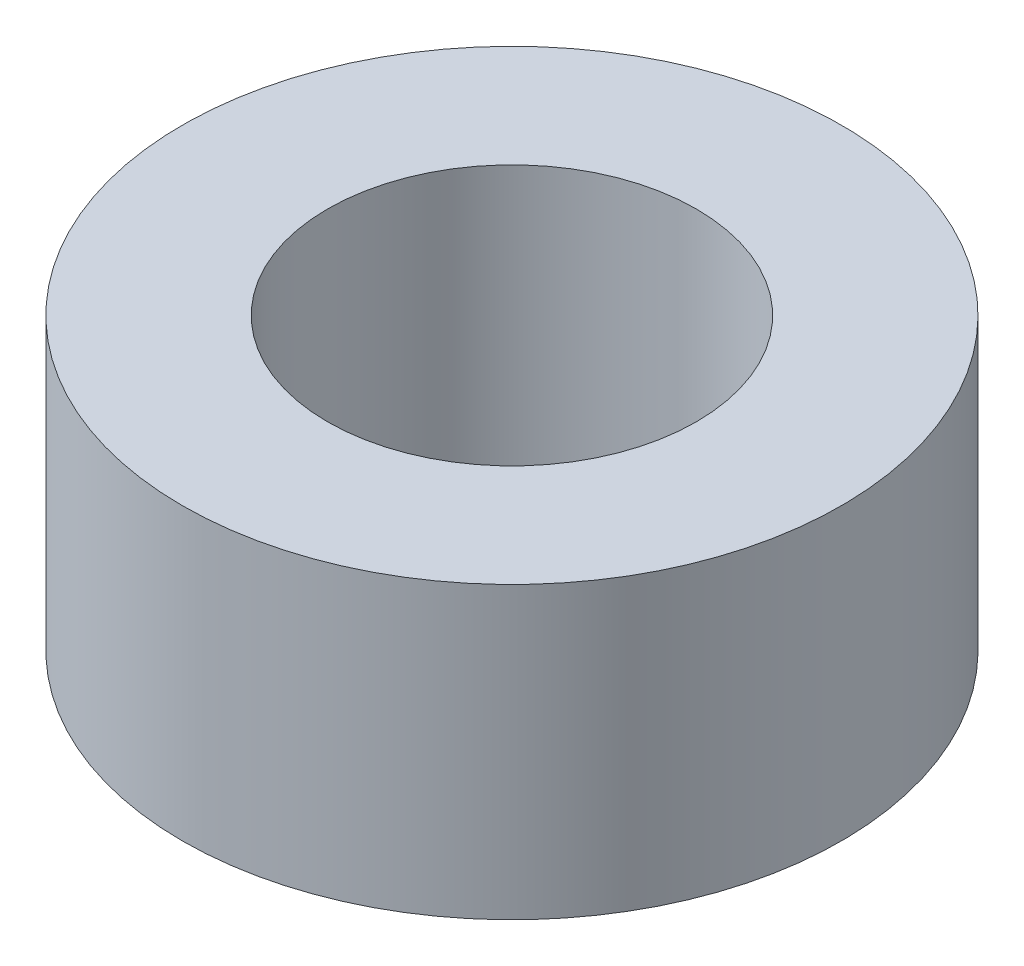
ISO-10303-21;
HEADER;
FILE_DESCRIPTION(('STEP AP214'),'2;1');
FILE_NAME('part.step','',(''),(''),'','','');
FILE_SCHEMA(('AUTOMOTIVE_DESIGN { 1 0 10303 214 1 1 1 1 }'));
ENDSEC;
DATA;
#1=APPLICATION_CONTEXT('core data for automotive mechanical design processes');
#2=APPLICATION_PROTOCOL_DEFINITION('international standard','automotive_design',2000,#1);
#3=PRODUCT_CONTEXT('',#1,'mechanical');
#4=PRODUCT('Part','Part','',(#3));
#5=PRODUCT_RELATED_PRODUCT_CATEGORY('part','',(#4));
#6=PRODUCT_DEFINITION_FORMATION('','',#4);
#7=PRODUCT_DEFINITION_CONTEXT('part definition',#1,'design');
#8=PRODUCT_DEFINITION('design','',#6,#7);
#9=PRODUCT_DEFINITION_SHAPE('','',#8);
#10=(LENGTH_UNIT() NAMED_UNIT(*) SI_UNIT(.MILLI.,.METRE.));
#11=(NAMED_UNIT(*) PLANE_ANGLE_UNIT() SI_UNIT($,.RADIAN.));
#12=(NAMED_UNIT(*) SI_UNIT($,.STERADIAN.) SOLID_ANGLE_UNIT());
#13=UNCERTAINTY_MEASURE_WITH_UNIT(LENGTH_MEASURE(1.E-05),#10,'distance_accuracy_value','');
#14=(GEOMETRIC_REPRESENTATION_CONTEXT(3) GLOBAL_UNCERTAINTY_ASSIGNED_CONTEXT((#13)) GLOBAL_UNIT_ASSIGNED_CONTEXT((#10,
#11,#12)) REPRESENTATION_CONTEXT('',''));
#15=CARTESIAN_POINT('',(0.,0.,0.));
#16=DIRECTION('',(0.,0.,1.));
#17=DIRECTION('',(1.,0.,0.));
#18=AXIS2_PLACEMENT_3D('',#15,#16,#17);
#19=CARTESIAN_POINT('',(0.,10.,0.));
#20=DIRECTION('',(0.,1.,0.));
#21=DIRECTION('',(0.,0.,1.));
#22=AXIS2_PLACEMENT_3D('',#19,#20,#21);
#23=PLANE('',#22);
#24=CARTESIAN_POINT('',(0.,10.,0.));
#25=DIRECTION('',(0.,1.,0.));
#26=DIRECTION('',(0.,0.,1.));
#27=AXIS2_PLACEMENT_3D('',#24,#25,#26);
#28=CIRCLE('',#27,22.7);
#29=CARTESIAN_POINT('',(0.,10.,22.7));
#30=VERTEX_POINT('',#29);
#31=EDGE_CURVE('E139',#30,#30,#28,.T.);
#32=ORIENTED_EDGE('',*,*,#31,.T.);
#33=EDGE_LOOP('',(#32));
#34=FACE_BOUND('',#33,.T.);
#35=CARTESIAN_POINT('',(0.,10.,0.));
#36=DIRECTION('',(0.,1.,0.));
#37=DIRECTION('',(0.,0.,1.));
#38=AXIS2_PLACEMENT_3D('',#35,#36,#37);
#39=CIRCLE('',#38,12.7);
#40=CARTESIAN_POINT('',(0.,10.,12.7));
#41=VERTEX_POINT('',#40);
#42=EDGE_CURVE('E133',#41,#41,#39,.T.);
#43=ORIENTED_EDGE('',*,*,#42,.F.);
#44=EDGE_LOOP('',(#43));
#45=FACE_BOUND('',#44,.T.);
#46=ADVANCED_FACE('F35',(#34,#45),#23,.T.);
#47=CARTESIAN_POINT('',(0.,-10.,0.));
#48=DIRECTION('',(0.,1.,0.));
#49=DIRECTION('',(0.,0.,1.));
#50=AXIS2_PLACEMENT_3D('',#47,#48,#49);
#51=PLANE('',#50);
#52=CARTESIAN_POINT('',(0.,-10.,0.));
#53=DIRECTION('',(0.,1.,0.));
#54=DIRECTION('',(0.,0.,1.));
#55=AXIS2_PLACEMENT_3D('',#52,#53,#54);
#56=CIRCLE('',#55,22.7);
#57=CARTESIAN_POINT('',(0.,-10.,22.7));
#58=VERTEX_POINT('',#57);
#59=EDGE_CURVE('E136',#58,#58,#56,.T.);
#60=ORIENTED_EDGE('',*,*,#59,.F.);
#61=EDGE_LOOP('',(#60));
#62=FACE_BOUND('',#61,.T.);
#63=CARTESIAN_POINT('',(0.,-10.,0.));
#64=DIRECTION('',(0.,1.,0.));
#65=DIRECTION('',(0.,0.,1.));
#66=AXIS2_PLACEMENT_3D('',#63,#64,#65);
#67=CIRCLE('',#66,12.7);
#68=CARTESIAN_POINT('',(0.,-10.,12.7));
#69=VERTEX_POINT('',#68);
#70=EDGE_CURVE('E122',#69,#69,#67,.T.);
#71=ORIENTED_EDGE('',*,*,#70,.T.);
#72=EDGE_LOOP('',(#71));
#73=FACE_BOUND('',#72,.T.);
#74=ADVANCED_FACE('F174',(#62,#73),#51,.F.);
#75=CARTESIAN_POINT('',(0.,10.,0.));
#76=DIRECTION('',(0.,-1.,0.));
#77=DIRECTION('',(0.,0.,-1.));
#78=AXIS2_PLACEMENT_3D('',#75,#76,#77);
#79=CYLINDRICAL_SURFACE('',#78,22.7);
#80=CARTESIAN_POINT('',(0.,-5.,0.));
#81=DIRECTION('',(0.,-1.,0.));
#82=DIRECTION('',(0.,0.,-1.));
#83=AXIS2_PLACEMENT_3D('',#80,#81,#82);
#84=CIRCLE('',#83,22.7);
#85=CARTESIAN_POINT('',(-22.515698227385,-5.,2.88675134594813));
#86=VERTEX_POINT('',#85);
#87=CARTESIAN_POINT('',(-22.515698227385,-5.,-2.88675134594813));
#88=VERTEX_POINT('',#87);
#89=EDGE_CURVE('E43',#86,#88,#84,.T.);
#90=ORIENTED_EDGE('',*,*,#89,.T.);
#91=CARTESIAN_POINT('',(0.,-10.,0.));
#92=DIRECTION('',(0.,-0.5,-0.866025403784439));
#93=DIRECTION('',(0.,-0.866025403784439,0.5));
#94=AXIS2_PLACEMENT_3D('',#91,#92,#93);
#95=ELLIPSE('',#94,45.4,22.7);
#96=CARTESIAN_POINT('',(-21.9535114882942,0.,-5.77350269189626));
#97=VERTEX_POINT('',#96);
#98=EDGE_CURVE('E11',#88,#97,#95,.T.);
#99=ORIENTED_EDGE('',*,*,#98,.T.);
#100=CARTESIAN_POINT('',(0.,10.,0.));
#101=DIRECTION('',(0.,0.5,-0.866025403784439));
#102=DIRECTION('',(0.,-0.866025403784439,-0.5));
#103=AXIS2_PLACEMENT_3D('',#100,#101,#102);
#104=ELLIPSE('',#103,45.4,22.7);
#105=CARTESIAN_POINT('',(-22.515698227385,5.,-2.88675134594813));
#106=VERTEX_POINT('',#105);
#107=EDGE_CURVE('E89',#97,#106,#104,.T.);
#108=ORIENTED_EDGE('',*,*,#107,.T.);
#109=CARTESIAN_POINT('',(0.,5.,0.));
#110=DIRECTION('',(0.,1.,0.));
#111=DIRECTION('',(0.,0.,1.));
#112=AXIS2_PLACEMENT_3D('',#109,#110,#111);
#113=CIRCLE('',#112,22.7);
#114=CARTESIAN_POINT('',(-22.515698227385,5.,2.88675134594813));
#115=VERTEX_POINT('',#114);
#116=EDGE_CURVE('E145',#106,#115,#113,.T.);
#117=ORIENTED_EDGE('',*,*,#116,.T.);
#118=CARTESIAN_POINT('',(0.,10.,0.));
#119=DIRECTION('',(0.,0.5,0.866025403784439));
#120=DIRECTION('',(0.,-0.866025403784439,0.5));
#121=AXIS2_PLACEMENT_3D('',#118,#119,#120);
#122=ELLIPSE('',#121,45.4,22.7);
#123=CARTESIAN_POINT('',(-21.9535114882942,0.,5.77350269189626));
#124=VERTEX_POINT('',#123);
#125=EDGE_CURVE('E148',#115,#124,#122,.T.);
#126=ORIENTED_EDGE('',*,*,#125,.T.);
#127=CARTESIAN_POINT('',(0.,-10.,0.));
#128=DIRECTION('',(0.,-0.5,0.866025403784439));
#129=DIRECTION('',(0.,-0.866025403784439,-0.5));
#130=AXIS2_PLACEMENT_3D('',#127,#128,#129);
#131=ELLIPSE('',#130,45.4,22.7);
#132=EDGE_CURVE('E151',#124,#86,#131,.T.);
#133=ORIENTED_EDGE('',*,*,#132,.T.);
#134=EDGE_LOOP('',(#90,#99,#108,#117,#126,#133));
#135=FACE_BOUND('',#134,.T.);
#136=ORIENTED_EDGE('',*,*,#31,.F.);
#137=EDGE_LOOP('',(#136));
#138=FACE_BOUND('',#137,.T.);
#139=ORIENTED_EDGE('',*,*,#59,.T.);
#140=EDGE_LOOP('',(#139));
#141=FACE_BOUND('',#140,.T.);
#142=ADVANCED_FACE('F37',(#135,#138,#141),#79,.T.);
#143=CARTESIAN_POINT('',(0.,10.,0.));
#144=DIRECTION('',(0.,-1.,0.));
#145=DIRECTION('',(0.,0.,-1.));
#146=AXIS2_PLACEMENT_3D('',#143,#144,#145);
#147=CYLINDRICAL_SURFACE('',#146,12.7);
#148=ORIENTED_EDGE('',*,*,#42,.T.);
#149=EDGE_LOOP('',(#148));
#150=FACE_BOUND('',#149,.T.);
#151=ORIENTED_EDGE('',*,*,#70,.F.);
#152=EDGE_LOOP('',(#151));
#153=FACE_BOUND('',#152,.T.);
#154=ADVANCED_FACE('F183',(#150,#153),#147,.F.);
#155=CARTESIAN_POINT('',(-25.,-5.,-2.88675134594813));
#156=DIRECTION('',(0.,-0.5,-0.866025403784439));
#157=DIRECTION('',(0.,0.866025403784439,-0.5));
#158=AXIS2_PLACEMENT_3D('',#155,#156,#157);
#159=PLANE('',#158);
#160=ORIENTED_EDGE('',*,*,#98,.F.);
#161=DIRECTION('',(1.,0.,0.));
#162=VECTOR('',#161,1.);
#163=CARTESIAN_POINT('',(-25.,-5.,-2.88675134594813));
#164=LINE('',#163,#162);
#165=CARTESIAN_POINT('',(-25.,-5.,-2.88675134594813));
#166=VERTEX_POINT('',#165);
#167=EDGE_CURVE('E105',#166,#88,#164,.T.);
#168=ORIENTED_EDGE('',*,*,#167,.F.);
#169=DIRECTION('',(0.,0.866025403784439,-0.5));
#170=VECTOR('',#169,1.);
#171=CARTESIAN_POINT('',(-25.,-5.,-2.88675134594813));
#172=LINE('',#171,#170);
#173=CARTESIAN_POINT('',(-25.,0.,-5.77350269189626));
#174=VERTEX_POINT('',#173);
#175=EDGE_CURVE('E98',#166,#174,#172,.T.);
#176=ORIENTED_EDGE('',*,*,#175,.T.);
#177=DIRECTION('',(1.,0.,0.));
#178=VECTOR('',#177,1.);
#179=CARTESIAN_POINT('',(-25.,0.,-5.77350269189626));
#180=LINE('',#179,#178);
#181=EDGE_CURVE('E84',#174,#97,#180,.T.);
#182=ORIENTED_EDGE('',*,*,#181,.T.);
#183=EDGE_LOOP('',(#160,#168,#176,#182));
#184=FACE_BOUND('',#183,.T.);
#185=ADVANCED_FACE('F104',(#184),#159,.T.);
#186=CARTESIAN_POINT('',(-25.,-5.,2.88675134594813));
#187=DIRECTION('',(0.,-1.,0.));
#188=DIRECTION('',(0.,0.,-1.));
#189=AXIS2_PLACEMENT_3D('',#186,#187,#188);
#190=PLANE('',#189);
#191=ORIENTED_EDGE('',*,*,#89,.F.);
#192=DIRECTION('',(1.,0.,0.));
#193=VECTOR('',#192,1.);
#194=CARTESIAN_POINT('',(-25.,-5.,2.88675134594813));
#195=LINE('',#194,#193);
#196=CARTESIAN_POINT('',(-25.,-5.,2.88675134594813));
#197=VERTEX_POINT('',#196);
#198=EDGE_CURVE('E123',#197,#86,#195,.T.);
#199=ORIENTED_EDGE('',*,*,#198,.F.);
#200=DIRECTION('',(0.,0.,-1.));
#201=VECTOR('',#200,1.);
#202=CARTESIAN_POINT('',(-25.,-5.,2.88675134594813));
#203=LINE('',#202,#201);
#204=EDGE_CURVE('E91',#197,#166,#203,.T.);
#205=ORIENTED_EDGE('',*,*,#204,.T.);
#206=ORIENTED_EDGE('',*,*,#167,.T.);
#207=EDGE_LOOP('',(#191,#199,#205,#206));
#208=FACE_BOUND('',#207,.T.);
#209=ADVANCED_FACE('F157',(#208),#190,.T.);
#210=CARTESIAN_POINT('',(-25.,0.,5.77350269189626));
#211=DIRECTION('',(0.,-0.5,0.866025403784439));
#212=DIRECTION('',(0.,-0.866025403784439,-0.5));
#213=AXIS2_PLACEMENT_3D('',#210,#211,#212);
#214=PLANE('',#213);
#215=ORIENTED_EDGE('',*,*,#132,.F.);
#216=DIRECTION('',(1.,0.,0.));
#217=VECTOR('',#216,1.);
#218=CARTESIAN_POINT('',(-25.,0.,5.77350269189626));
#219=LINE('',#218,#217);
#220=CARTESIAN_POINT('',(-25.,0.,5.77350269189626));
#221=VERTEX_POINT('',#220);
#222=EDGE_CURVE('E126',#221,#124,#219,.T.);
#223=ORIENTED_EDGE('',*,*,#222,.F.);
#224=DIRECTION('',(0.,-0.866025403784439,-0.5));
#225=VECTOR('',#224,1.);
#226=CARTESIAN_POINT('',(-25.,0.,5.77350269189626));
#227=LINE('',#226,#225);
#228=EDGE_CURVE('E117',#221,#197,#227,.T.);
#229=ORIENTED_EDGE('',*,*,#228,.T.);
#230=ORIENTED_EDGE('',*,*,#198,.T.);
#231=EDGE_LOOP('',(#215,#223,#229,#230));
#232=FACE_BOUND('',#231,.T.);
#233=ADVANCED_FACE('F159',(#232),#214,.T.);
#234=CARTESIAN_POINT('',(-25.,5.,2.88675134594813));
#235=DIRECTION('',(0.,0.5,0.866025403784439));
#236=DIRECTION('',(0.,-0.866025403784439,0.5));
#237=AXIS2_PLACEMENT_3D('',#234,#235,#236);
#238=PLANE('',#237);
#239=ORIENTED_EDGE('',*,*,#125,.F.);
#240=DIRECTION('',(1.,0.,0.));
#241=VECTOR('',#240,1.);
#242=CARTESIAN_POINT('',(-25.,5.,2.88675134594813));
#243=LINE('',#242,#241);
#244=CARTESIAN_POINT('',(-25.,5.,2.88675134594813));
#245=VERTEX_POINT('',#244);
#246=EDGE_CURVE('E129',#245,#115,#243,.T.);
#247=ORIENTED_EDGE('',*,*,#246,.F.);
#248=DIRECTION('',(0.,-0.866025403784439,0.5));
#249=VECTOR('',#248,1.);
#250=CARTESIAN_POINT('',(-25.,5.,2.88675134594813));
#251=LINE('',#250,#249);
#252=EDGE_CURVE('E114',#245,#221,#251,.T.);
#253=ORIENTED_EDGE('',*,*,#252,.T.);
#254=ORIENTED_EDGE('',*,*,#222,.T.);
#255=EDGE_LOOP('',(#239,#247,#253,#254));
#256=FACE_BOUND('',#255,.T.);
#257=ADVANCED_FACE('F162',(#256),#238,.T.);
#258=CARTESIAN_POINT('',(-25.,5.,-2.88675134594813));
#259=DIRECTION('',(0.,1.,0.));
#260=DIRECTION('',(0.,0.,1.));
#261=AXIS2_PLACEMENT_3D('',#258,#259,#260);
#262=PLANE('',#261);
#263=ORIENTED_EDGE('',*,*,#116,.F.);
#264=DIRECTION('',(1.,0.,0.));
#265=VECTOR('',#264,1.);
#266=CARTESIAN_POINT('',(-25.,5.,-2.88675134594813));
#267=LINE('',#266,#265);
#268=CARTESIAN_POINT('',(-25.,5.,-2.88675134594813));
#269=VERTEX_POINT('',#268);
#270=EDGE_CURVE('E50',#269,#106,#267,.T.);
#271=ORIENTED_EDGE('',*,*,#270,.F.);
#272=DIRECTION('',(0.,0.,1.));
#273=VECTOR('',#272,1.);
#274=CARTESIAN_POINT('',(-25.,5.,-2.88675134594813));
#275=LINE('',#274,#273);
#276=EDGE_CURVE('E102',#269,#245,#275,.T.);
#277=ORIENTED_EDGE('',*,*,#276,.T.);
#278=ORIENTED_EDGE('',*,*,#246,.T.);
#279=EDGE_LOOP('',(#263,#271,#277,#278));
#280=FACE_BOUND('',#279,.T.);
#281=ADVANCED_FACE('F164',(#280),#262,.T.);
#282=CARTESIAN_POINT('',(-25.,0.,-5.77350269189626));
#283=DIRECTION('',(0.,0.5,-0.866025403784439));
#284=DIRECTION('',(0.,0.866025403784439,0.5));
#285=AXIS2_PLACEMENT_3D('',#282,#283,#284);
#286=PLANE('',#285);
#287=ORIENTED_EDGE('',*,*,#107,.F.);
#288=ORIENTED_EDGE('',*,*,#181,.F.);
#289=DIRECTION('',(0.,0.866025403784439,0.5));
#290=VECTOR('',#289,1.);
#291=CARTESIAN_POINT('',(-25.,0.,-5.77350269189626));
#292=LINE('',#291,#290);
#293=EDGE_CURVE('E87',#174,#269,#292,.T.);
#294=ORIENTED_EDGE('',*,*,#293,.T.);
#295=ORIENTED_EDGE('',*,*,#270,.T.);
#296=EDGE_LOOP('',(#287,#288,#294,#295));
#297=FACE_BOUND('',#296,.T.);
#298=ADVANCED_FACE('F86',(#297),#286,.T.);
#299=CARTESIAN_POINT('',(-25.,0.,0.));
#300=DIRECTION('',(1.,0.,0.));
#301=DIRECTION('',(0.,0.,-1.));
#302=AXIS2_PLACEMENT_3D('',#299,#300,#301);
#303=PLANE('',#302);
#304=CARTESIAN_POINT('',(-25.,0.,0.));
#305=DIRECTION('',(-1.,0.,0.));
#306=DIRECTION('',(0.,0.,1.));
#307=AXIS2_PLACEMENT_3D('',#304,#305,#306);
#308=CIRCLE('',#307,4.);
#309=CARTESIAN_POINT('',(-25.,0.,4.));
#310=VERTEX_POINT('',#309);
#311=EDGE_CURVE('E109',#310,#310,#308,.T.);
#312=ORIENTED_EDGE('',*,*,#311,.F.);
#313=EDGE_LOOP('',(#312));
#314=FACE_BOUND('',#313,.T.);
#315=ORIENTED_EDGE('',*,*,#175,.F.);
#316=ORIENTED_EDGE('',*,*,#204,.F.);
#317=ORIENTED_EDGE('',*,*,#228,.F.);
#318=ORIENTED_EDGE('',*,*,#252,.F.);
#319=ORIENTED_EDGE('',*,*,#276,.F.);
#320=ORIENTED_EDGE('',*,*,#293,.F.);
#321=EDGE_LOOP('',(#315,#316,#317,#318,#319,#320));
#322=FACE_BOUND('',#321,.T.);
#323=ADVANCED_FACE('F96',(#314,#322),#303,.F.);
#324=CARTESIAN_POINT('',(-20.,0.,0.));
#325=DIRECTION('',(-1.,0.,0.));
#326=DIRECTION('',(0.,0.,1.));
#327=AXIS2_PLACEMENT_3D('',#324,#325,#326);
#328=CYLINDRICAL_SURFACE('',#327,4.);
#329=CARTESIAN_POINT('',(-20.,0.,0.));
#330=DIRECTION('',(-1.,0.,0.));
#331=DIRECTION('',(0.,0.,1.));
#332=AXIS2_PLACEMENT_3D('',#329,#330,#331);
#333=CIRCLE('',#332,4.);
#334=CARTESIAN_POINT('',(-20.,0.,4.));
#335=VERTEX_POINT('',#334);
#336=EDGE_CURVE('E106',#335,#335,#333,.T.);
#337=ORIENTED_EDGE('',*,*,#336,.F.);
#338=EDGE_LOOP('',(#337));
#339=FACE_BOUND('',#338,.T.);
#340=ORIENTED_EDGE('',*,*,#311,.T.);
#341=EDGE_LOOP('',(#340));
#342=FACE_BOUND('',#341,.T.);
#343=ADVANCED_FACE('F199',(#339,#342),#328,.F.);
#344=CARTESIAN_POINT('',(-20.,0.,0.));
#345=DIRECTION('',(-1.,0.,0.));
#346=DIRECTION('',(0.,0.,1.));
#347=AXIS2_PLACEMENT_3D('',#344,#345,#346);
#348=PLANE('',#347);
#349=ORIENTED_EDGE('',*,*,#336,.T.);
#350=EDGE_LOOP('',(#349));
#351=FACE_BOUND('',#350,.T.);
#352=ADVANCED_FACE('F203',(#351),#348,.T.);
#353=CLOSED_SHELL('',(#46,#74,#142,#154,#185,#209,#233,#257,#281,#298,#323,#343,#352));
#354=MANIFOLD_SOLID_BREP('B2',#353);
#355=ADVANCED_BREP_SHAPE_REPRESENTATION('',(#18,#354),#14);
#356=SHAPE_DEFINITION_REPRESENTATION(#9,#355);
ENDSEC;
END-ISO-10303-21;
